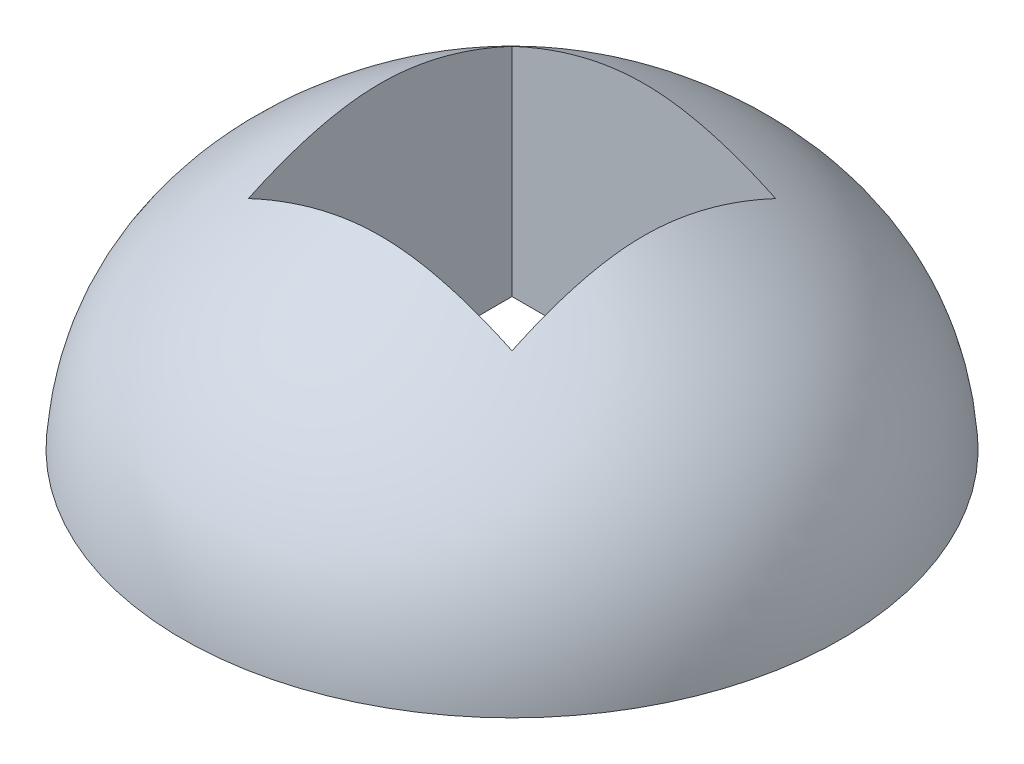
ISO-10303-21;
HEADER;
FILE_DESCRIPTION(('STEP AP214'),'2;1');
FILE_NAME('part.step','',(''),(''),'','','');
FILE_SCHEMA(('AUTOMOTIVE_DESIGN { 1 0 10303 214 1 1 1 1 }'));
ENDSEC;
DATA;
#1=APPLICATION_CONTEXT('core data for automotive mechanical design processes');
#2=APPLICATION_PROTOCOL_DEFINITION('international standard','automotive_design',2000,#1);
#3=PRODUCT_CONTEXT('',#1,'mechanical');
#4=PRODUCT('Part','Part','',(#3));
#5=PRODUCT_RELATED_PRODUCT_CATEGORY('part','',(#4));
#6=PRODUCT_DEFINITION_FORMATION('','',#4);
#7=PRODUCT_DEFINITION_CONTEXT('part definition',#1,'design');
#8=PRODUCT_DEFINITION('design','',#6,#7);
#9=PRODUCT_DEFINITION_SHAPE('','',#8);
#10=(LENGTH_UNIT() NAMED_UNIT(*) SI_UNIT(.MILLI.,.METRE.));
#11=(NAMED_UNIT(*) PLANE_ANGLE_UNIT() SI_UNIT($,.RADIAN.));
#12=(NAMED_UNIT(*) SI_UNIT($,.STERADIAN.) SOLID_ANGLE_UNIT());
#13=UNCERTAINTY_MEASURE_WITH_UNIT(LENGTH_MEASURE(1.E-05),#10,'distance_accuracy_value','');
#14=(GEOMETRIC_REPRESENTATION_CONTEXT(3) GLOBAL_UNCERTAINTY_ASSIGNED_CONTEXT((#13)) GLOBAL_UNIT_ASSIGNED_CONTEXT((#10,
#11,#12)) REPRESENTATION_CONTEXT('',''));
#15=CARTESIAN_POINT('',(0.,0.,0.));
#16=DIRECTION('',(0.,0.,1.));
#17=DIRECTION('',(1.,0.,0.));
#18=AXIS2_PLACEMENT_3D('',#15,#16,#17);
#19=CARTESIAN_POINT('',(0.,0.,0.));
#20=DIRECTION('',(0.,-1.,0.));
#21=DIRECTION('',(0.,0.,-1.));
#22=AXIS2_PLACEMENT_3D('',#19,#20,#21);
#23=PLANE('',#22);
#24=DIRECTION('',(0.,0.,1.));
#25=VECTOR('',#24,1.);
#26=CARTESIAN_POINT('',(0.2,0.,-0.2));
#27=LINE('',#26,#25);
#28=CARTESIAN_POINT('',(0.2,0.,-0.2));
#29=VERTEX_POINT('',#28);
#30=CARTESIAN_POINT('',(0.2,0.,0.2));
#31=VERTEX_POINT('',#30);
#32=EDGE_CURVE('E52',#29,#31,#27,.T.);
#33=ORIENTED_EDGE('',*,*,#32,.F.);
#34=DIRECTION('',(1.,0.,0.));
#35=VECTOR('',#34,1.);
#36=CARTESIAN_POINT('',(-0.2,0.,-0.2));
#37=LINE('',#36,#35);
#38=CARTESIAN_POINT('',(-0.2,0.,-0.2));
#39=VERTEX_POINT('',#38);
#40=EDGE_CURVE('E95',#39,#29,#37,.T.);
#41=ORIENTED_EDGE('',*,*,#40,.F.);
#42=DIRECTION('',(0.,0.,-1.));
#43=VECTOR('',#42,1.);
#44=CARTESIAN_POINT('',(-0.2,0.,-0.2));
#45=LINE('',#44,#43);
#46=CARTESIAN_POINT('',(-0.2,0.,0.2));
#47=VERTEX_POINT('',#46);
#48=EDGE_CURVE('E80',#47,#39,#45,.T.);
#49=ORIENTED_EDGE('',*,*,#48,.F.);
#50=DIRECTION('',(-1.,0.,0.));
#51=VECTOR('',#50,1.);
#52=CARTESIAN_POINT('',(-0.2,0.,0.2));
#53=LINE('',#52,#51);
#54=EDGE_CURVE('E89',#31,#47,#53,.T.);
#55=ORIENTED_EDGE('',*,*,#54,.F.);
#56=EDGE_LOOP('',(#33,#41,#49,#55));
#57=FACE_BOUND('',#56,.T.);
#58=CARTESIAN_POINT('',(0.,0.,0.));
#59=DIRECTION('',(0.,-1.,0.));
#60=DIRECTION('',(0.,0.,-1.));
#61=AXIS2_PLACEMENT_3D('',#58,#59,#60);
#62=CIRCLE('',#61,0.5);
#63=CARTESIAN_POINT('',(0.,0.,-0.5));
#64=VERTEX_POINT('',#63);
#65=EDGE_CURVE('E102',#64,#64,#62,.T.);
#66=ORIENTED_EDGE('',*,*,#65,.T.);
#67=EDGE_LOOP('',(#66));
#68=FACE_BOUND('',#67,.T.);
#69=ADVANCED_FACE('F33',(#57,#68),#23,.T.);
#70=CARTESIAN_POINT('',(0.5,0.,0.));
#71=CARTESIAN_POINT('',(0.480286730658789,0.285294789216923,0.));
#72=CARTESIAN_POINT('',(0.196047082133175,0.362615464846656,0.));
#73=CARTESIAN_POINT('',(0.,0.5,0.));
#74=B_SPLINE_CURVE_WITH_KNOTS('',3,(#70,#71,#72,#73),.UNSPECIFIED.,.F.,.F.,(4,4),(0.,1.),.UNSPECIFIED.);
#75=CARTESIAN_POINT('',(0.,0.,0.));
#76=DIRECTION('',(0.,-1.,0.));
#77=AXIS1_PLACEMENT('',#75,#76);
#78=SURFACE_OF_REVOLUTION('',#74,#77);
#79=CARTESIAN_POINT('',(0.200000000000068,0.328782187451355,0.200000000000024));
#80=CARTESIAN_POINT('',(0.200000000000025,0.335982640172982,0.184679463846204));
#81=CARTESIAN_POINT('',(0.200000000000007,0.342680838061193,0.169108599364926));
#82=CARTESIAN_POINT('',(0.199999999999993,0.354818342354779,0.13728336844331));
#83=CARTESIAN_POINT('',(0.199999999999998,0.360242327810111,0.12102321069613));
#84=CARTESIAN_POINT('',(0.200000000000003,0.370739603122892,0.0831417285857149));
#85=CARTESIAN_POINT('',(0.2,0.375243111782503,0.0613471360507934));
#86=CARTESIAN_POINT('',(0.2,0.378961904335457,0.0283785029903254));
#87=CARTESIAN_POINT('',(0.2,0.379697493847905,0.0173729332208342));
#88=CARTESIAN_POINT('',(0.2,0.380105293462711,-0.00465744244411206));
#89=CARTESIAN_POINT('',(0.2,0.379777627420552,-0.0156822459495619));
#90=CARTESIAN_POINT('',(0.199999999999999,0.37728545320003,-0.0479447823239719));
#91=CARTESIAN_POINT('',(0.2,0.373687790732988,-0.0690750385354958));
#92=CARTESIAN_POINT('',(0.2,0.363578298443816,-0.110686195527506));
#93=CARTESIAN_POINT('',(0.2,0.357051222828506,-0.131163090979574));
#94=CARTESIAN_POINT('',(0.2,0.346367639518441,-0.159529089093317));
#95=CARTESIAN_POINT('',(0.2,0.343067284437024,-0.167754447835112));
#96=CARTESIAN_POINT('',(0.2,0.336155680161305,-0.184009768267965));
#97=CARTESIAN_POINT('',(0.2,0.332546618507188,-0.192040659288157));
#98=CARTESIAN_POINT('',(0.2,0.328782187451422,-0.200000000000042));
#99=B_SPLINE_CURVE_WITH_KNOTS('',3,(#79,#80,#81,#82,#83,#84,#85,#86,#87,#88,#89,#90,#91,#92,#93,
#94,#95,#96,#97,#98),.UNSPECIFIED.,.F.,.F.,(4,2,2,2,2,2,2,2,2,4),(0.,0.05078825211544,
0.102159054248229,0.168601630031518,0.201644877353965,0.234684275704794,0.298673858729676,
0.363000400971716,0.389583700771525,0.415992160229419),.UNSPECIFIED.);
#100=CARTESIAN_POINT('',(0.2,0.328782187451355,0.2));
#101=VERTEX_POINT('',#100);
#102=CARTESIAN_POINT('',(0.2,0.328782187451437,-0.2));
#103=VERTEX_POINT('',#102);
#104=EDGE_CURVE('E11',#101,#103,#99,.T.);
#105=ORIENTED_EDGE('',*,*,#104,.F.);
#106=CARTESIAN_POINT('',(-0.199999999999964,0.328782187451437,0.200000000000048));
#107=CARTESIAN_POINT('',(-0.184679463846135,0.335982640173032,0.200000000000017));
#108=CARTESIAN_POINT('',(-0.169108599364854,0.342680838061228,0.200000000000005));
#109=CARTESIAN_POINT('',(-0.137283368443238,0.354818342354799,0.199999999999995));
#110=CARTESIAN_POINT('',(-0.121023210696062,0.360242327810131,0.199999999999999));
#111=CARTESIAN_POINT('',(-0.0831417285856537,0.370739603122907,0.200000000000002));
#112=CARTESIAN_POINT('',(-0.061347136050735,0.375243111782514,0.2));
#113=CARTESIAN_POINT('',(-0.0283785029902728,0.378961904335461,0.2));
#114=CARTESIAN_POINT('',(-0.0173729332207838,0.379697493847907,0.2));
#115=CARTESIAN_POINT('',(0.00465744244415787,0.38010529346271,0.2));
#116=CARTESIAN_POINT('',(0.0156822459496054,0.37977762742055,0.2));
#117=CARTESIAN_POINT('',(0.0479447823240094,0.377285453200024,0.2));
#118=CARTESIAN_POINT('',(0.0690750385355296,0.373687790732981,0.2));
#119=CARTESIAN_POINT('',(0.110686195527532,0.363578298443808,0.2));
#120=CARTESIAN_POINT('',(0.131163090979598,0.357051222828498,0.2));
#121=CARTESIAN_POINT('',(0.159529089093341,0.346367639518431,0.2));
#122=CARTESIAN_POINT('',(0.167754447835141,0.343067284437012,0.2));
#123=CARTESIAN_POINT('',(0.184009768268001,0.33615568016129,0.2));
#124=CARTESIAN_POINT('',(0.192040659288197,0.33254661850717,0.2));
#125=CARTESIAN_POINT('',(0.200000000000085,0.328782187451401,0.2));
#126=B_SPLINE_CURVE_WITH_KNOTS('',3,(#106,#107,#108,#109,#110,#111,#112,#113,#114,#115,#116,
#117,#118,#119,#120,#121,#122,#123,#124,#125),.UNSPECIFIED.,.F.,.F.,(4,2,2,2,2,2,2,2,2,4),(0.,
0.0507882521154294,0.102159054248209,0.168601630031486,0.201644877353926,0.234684275704748,
0.29867385872962,0.363000400971651,0.389583700771473,0.415992160229379),.UNSPECIFIED.);
#127=CARTESIAN_POINT('',(-0.199999999999964,0.328782187451437,0.200000000000048));
#128=VERTEX_POINT('',#127);
#129=EDGE_CURVE('E122',#128,#101,#126,.T.);
#130=ORIENTED_EDGE('',*,*,#129,.F.);
#131=CARTESIAN_POINT('',(-0.200000000000068,0.328782187451355,-0.200000000000024));
#132=CARTESIAN_POINT('',(-0.200000000000025,0.335982640172982,-0.184679463846204));
#133=CARTESIAN_POINT('',(-0.200000000000007,0.342680838061193,-0.169108599364926));
#134=CARTESIAN_POINT('',(-0.199999999999993,0.35481834235478,-0.13728336844331));
#135=CARTESIAN_POINT('',(-0.199999999999998,0.360242327810111,-0.12102321069613));
#136=CARTESIAN_POINT('',(-0.200000000000003,0.370739603122892,-0.0831417285857147));
#137=CARTESIAN_POINT('',(-0.2,0.375243111782504,-0.0613471360507932));
#138=CARTESIAN_POINT('',(-0.2,0.378961904335457,-0.0283785029903253));
#139=CARTESIAN_POINT('',(-0.2,0.379697493847905,-0.0173729332208341));
#140=CARTESIAN_POINT('',(-0.2,0.380105293462711,0.00465744244411216));
#141=CARTESIAN_POINT('',(-0.2,0.379777627420552,0.015682245949562));
#142=CARTESIAN_POINT('',(-0.2,0.37728545320003,0.047944782323972));
#143=CARTESIAN_POINT('',(-0.2,0.373687790732988,0.0690750385354959));
#144=CARTESIAN_POINT('',(-0.2,0.363578298443816,0.110686195527506));
#145=CARTESIAN_POINT('',(-0.2,0.357051222828506,0.131163090979574));
#146=CARTESIAN_POINT('',(-0.2,0.346367639518441,0.159529089093317));
#147=CARTESIAN_POINT('',(-0.2,0.343067284437024,0.167754447835112));
#148=CARTESIAN_POINT('',(-0.2,0.336155680161305,0.184009768267965));
#149=CARTESIAN_POINT('',(-0.2,0.332546618507188,0.192040659288157));
#150=CARTESIAN_POINT('',(-0.2,0.328782187451422,0.200000000000042));
#151=B_SPLINE_CURVE_WITH_KNOTS('',3,(#131,#132,#133,#134,#135,#136,#137,#138,#139,#140,#141,
#142,#143,#144,#145,#146,#147,#148,#149,#150),.UNSPECIFIED.,.F.,.F.,(4,2,2,2,2,2,2,2,2,4),(0.,
0.0507882521154401,0.102159054248229,0.168601630031518,0.201644877353965,0.234684275704794,
0.298673858729676,0.363000400971716,0.389583700771525,0.415992160229419),.UNSPECIFIED.);
#152=CARTESIAN_POINT('',(-0.2,0.328782187451355,-0.2));
#153=VERTEX_POINT('',#152);
#154=EDGE_CURVE('E83',#153,#128,#151,.T.);
#155=ORIENTED_EDGE('',*,*,#154,.F.);
#156=CARTESIAN_POINT('',(0.199999999999964,0.328782187451437,-0.200000000000048));
#157=CARTESIAN_POINT('',(0.184679463846135,0.335982640173032,-0.200000000000017));
#158=CARTESIAN_POINT('',(0.169108599364854,0.342680838061228,-0.200000000000005));
#159=CARTESIAN_POINT('',(0.137283368443238,0.354818342354799,-0.199999999999995));
#160=CARTESIAN_POINT('',(0.121023210696062,0.360242327810131,-0.199999999999999));
#161=CARTESIAN_POINT('',(0.0831417285856536,0.370739603122907,-0.200000000000002));
#162=CARTESIAN_POINT('',(0.0613471360507349,0.375243111782514,-0.2));
#163=CARTESIAN_POINT('',(0.0283785029902727,0.378961904335461,-0.2));
#164=CARTESIAN_POINT('',(0.0173729332207837,0.379697493847907,-0.2));
#165=CARTESIAN_POINT('',(-0.00465744244415793,0.38010529346271,-0.2));
#166=CARTESIAN_POINT('',(-0.0156822459496054,0.37977762742055,-0.2));
#167=CARTESIAN_POINT('',(-0.0479447823240095,0.377285453200024,-0.2));
#168=CARTESIAN_POINT('',(-0.0690750385355297,0.373687790732982,-0.2));
#169=CARTESIAN_POINT('',(-0.110686195527532,0.363578298443808,-0.2));
#170=CARTESIAN_POINT('',(-0.131163090979598,0.357051222828498,-0.2));
#171=CARTESIAN_POINT('',(-0.159529089093341,0.346367639518431,-0.2));
#172=CARTESIAN_POINT('',(-0.167754447835141,0.343067284437012,-0.2));
#173=CARTESIAN_POINT('',(-0.184009768268001,0.33615568016129,-0.2));
#174=CARTESIAN_POINT('',(-0.192040659288197,0.33254661850717,-0.2));
#175=CARTESIAN_POINT('',(-0.200000000000085,0.328782187451401,-0.2));
#176=B_SPLINE_CURVE_WITH_KNOTS('',3,(#156,#157,#158,#159,#160,#161,#162,#163,#164,#165,#166,
#167,#168,#169,#170,#171,#172,#173,#174,#175),.UNSPECIFIED.,.F.,.F.,(4,2,2,2,2,2,2,2,2,4),(0.,
0.0507882521154294,0.102159054248209,0.168601630031486,0.201644877353926,0.234684275704748,
0.29867385872962,0.363000400971651,0.389583700771473,0.415992160229379),.UNSPECIFIED.);
#177=EDGE_CURVE('E45',#103,#153,#176,.T.);
#178=ORIENTED_EDGE('',*,*,#177,.F.);
#179=EDGE_LOOP('',(#105,#130,#155,#178));
#180=FACE_BOUND('',#179,.T.);
#181=ORIENTED_EDGE('',*,*,#65,.F.);
#182=EDGE_LOOP('',(#181));
#183=FACE_BOUND('',#182,.T.);
#184=ADVANCED_FACE('F113',(#180,#183),#78,.F.);
#185=CARTESIAN_POINT('',(0.2,0.5,-0.2));
#186=DIRECTION('',(1.,0.,0.));
#187=DIRECTION('',(0.,0.,-1.));
#188=AXIS2_PLACEMENT_3D('',#185,#186,#187);
#189=PLANE('',#188);
#190=ORIENTED_EDGE('',*,*,#104,.T.);
#191=DIRECTION('',(0.,-1.,0.));
#192=VECTOR('',#191,1.);
#193=CARTESIAN_POINT('',(0.2,0.5,-0.2));
#194=LINE('',#193,#192);
#195=EDGE_CURVE('E100',#103,#29,#194,.T.);
#196=ORIENTED_EDGE('',*,*,#195,.T.);
#197=ORIENTED_EDGE('',*,*,#32,.T.);
#198=DIRECTION('',(0.,-1.,0.));
#199=VECTOR('',#198,1.);
#200=CARTESIAN_POINT('',(0.2,0.5,0.2));
#201=LINE('',#200,#199);
#202=EDGE_CURVE('E86',#101,#31,#201,.T.);
#203=ORIENTED_EDGE('',*,*,#202,.F.);
#204=EDGE_LOOP('',(#190,#196,#197,#203));
#205=FACE_BOUND('',#204,.T.);
#206=ADVANCED_FACE('F116',(#205),#189,.F.);
#207=CARTESIAN_POINT('',(-0.2,0.5,-0.2));
#208=DIRECTION('',(0.,0.,-1.));
#209=DIRECTION('',(-1.,0.,0.));
#210=AXIS2_PLACEMENT_3D('',#207,#208,#209);
#211=PLANE('',#210);
#212=ORIENTED_EDGE('',*,*,#177,.T.);
#213=DIRECTION('',(0.,-1.,0.));
#214=VECTOR('',#213,1.);
#215=CARTESIAN_POINT('',(-0.2,0.5,-0.2));
#216=LINE('',#215,#214);
#217=EDGE_CURVE('E85',#153,#39,#216,.T.);
#218=ORIENTED_EDGE('',*,*,#217,.T.);
#219=ORIENTED_EDGE('',*,*,#40,.T.);
#220=ORIENTED_EDGE('',*,*,#195,.F.);
#221=EDGE_LOOP('',(#212,#218,#219,#220));
#222=FACE_BOUND('',#221,.T.);
#223=ADVANCED_FACE('F139',(#222),#211,.F.);
#224=CARTESIAN_POINT('',(-0.2,0.5,-0.2));
#225=DIRECTION('',(-1.,0.,0.));
#226=DIRECTION('',(0.,0.,1.));
#227=AXIS2_PLACEMENT_3D('',#224,#225,#226);
#228=PLANE('',#227);
#229=ORIENTED_EDGE('',*,*,#154,.T.);
#230=DIRECTION('',(0.,-1.,0.));
#231=VECTOR('',#230,1.);
#232=CARTESIAN_POINT('',(-0.2,0.5,0.2));
#233=LINE('',#232,#231);
#234=EDGE_CURVE('E60',#128,#47,#233,.T.);
#235=ORIENTED_EDGE('',*,*,#234,.T.);
#236=ORIENTED_EDGE('',*,*,#48,.T.);
#237=ORIENTED_EDGE('',*,*,#217,.F.);
#238=EDGE_LOOP('',(#229,#235,#236,#237));
#239=FACE_BOUND('',#238,.T.);
#240=ADVANCED_FACE('F77',(#239),#228,.F.);
#241=CARTESIAN_POINT('',(-0.2,0.5,0.2));
#242=DIRECTION('',(0.,0.,1.));
#243=DIRECTION('',(1.,0.,0.));
#244=AXIS2_PLACEMENT_3D('',#241,#242,#243);
#245=PLANE('',#244);
#246=ORIENTED_EDGE('',*,*,#129,.T.);
#247=ORIENTED_EDGE('',*,*,#202,.T.);
#248=ORIENTED_EDGE('',*,*,#54,.T.);
#249=ORIENTED_EDGE('',*,*,#234,.F.);
#250=EDGE_LOOP('',(#246,#247,#248,#249));
#251=FACE_BOUND('',#250,.T.);
#252=ADVANCED_FACE('F90',(#251),#245,.F.);
#253=CLOSED_SHELL('',(#69,#184,#206,#223,#240,#252));
#254=MANIFOLD_SOLID_BREP('B2',#253);
#255=ADVANCED_BREP_SHAPE_REPRESENTATION('',(#18,#254),#14);
#256=SHAPE_DEFINITION_REPRESENTATION(#9,#255);
ENDSEC;
END-ISO-10303-21;
